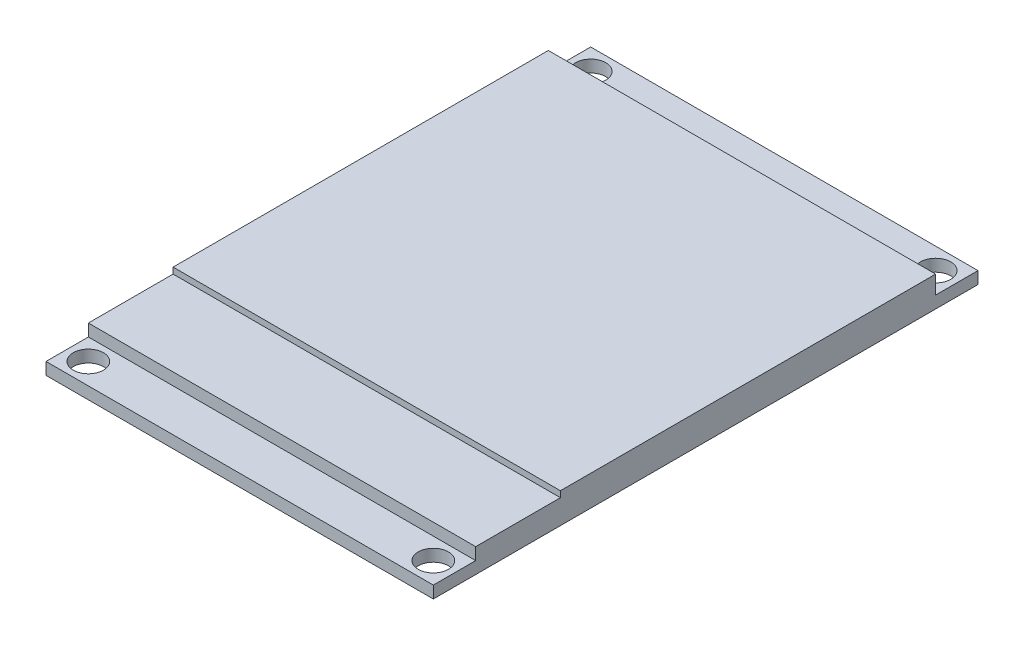
ISO-10303-21;
HEADER;
FILE_DESCRIPTION(('STEP AP214'),'2;1');
FILE_NAME('part.step','',(''),(''),'','','');
FILE_SCHEMA(('AUTOMOTIVE_DESIGN { 1 0 10303 214 1 1 1 1 }'));
ENDSEC;
DATA;
#1=APPLICATION_CONTEXT('core data for automotive mechanical design processes');
#2=APPLICATION_PROTOCOL_DEFINITION('international standard','automotive_design',2000,#1);
#3=PRODUCT_CONTEXT('',#1,'mechanical');
#4=PRODUCT('Part','Part','',(#3));
#5=PRODUCT_RELATED_PRODUCT_CATEGORY('part','',(#4));
#6=PRODUCT_DEFINITION_FORMATION('','',#4);
#7=PRODUCT_DEFINITION_CONTEXT('part definition',#1,'design');
#8=PRODUCT_DEFINITION('design','',#6,#7);
#9=PRODUCT_DEFINITION_SHAPE('','',#8);
#10=(LENGTH_UNIT() NAMED_UNIT(*) SI_UNIT(.MILLI.,.METRE.));
#11=(NAMED_UNIT(*) PLANE_ANGLE_UNIT() SI_UNIT($,.RADIAN.));
#12=(NAMED_UNIT(*) SI_UNIT($,.STERADIAN.) SOLID_ANGLE_UNIT());
#13=UNCERTAINTY_MEASURE_WITH_UNIT(LENGTH_MEASURE(1.E-05),#10,'distance_accuracy_value','');
#14=(GEOMETRIC_REPRESENTATION_CONTEXT(3) GLOBAL_UNCERTAINTY_ASSIGNED_CONTEXT((#13)) GLOBAL_UNIT_ASSIGNED_CONTEXT((#10,
#11,#12)) REPRESENTATION_CONTEXT('',''));
#15=CARTESIAN_POINT('',(0.,0.,0.));
#16=DIRECTION('',(0.,0.,1.));
#17=DIRECTION('',(1.,0.,0.));
#18=AXIS2_PLACEMENT_3D('',#15,#16,#17);
#19=CARTESIAN_POINT('',(0.,1.,0.));
#20=DIRECTION('',(0.,-1.,0.));
#21=DIRECTION('',(0.,0.,-1.));
#22=AXIS2_PLACEMENT_3D('',#19,#20,#21);
#23=PLANE('',#22);
#24=CARTESIAN_POINT('',(30.25,1.,-1.75));
#25=DIRECTION('',(0.,1.,0.));
#26=DIRECTION('',(0.,0.,-1.));
#27=AXIS2_PLACEMENT_3D('',#24,#25,#26);
#28=CIRCLE('',#27,1.25);
#29=CARTESIAN_POINT('',(30.25,1.,-3.));
#30=VERTEX_POINT('',#29);
#31=EDGE_CURVE('E170',#30,#30,#28,.T.);
#32=ORIENTED_EDGE('',*,*,#31,.F.);
#33=EDGE_LOOP('',(#32));
#34=FACE_BOUND('',#33,.T.);
#35=CARTESIAN_POINT('',(1.75,1.,-1.75));
#36=DIRECTION('',(0.,1.,0.));
#37=DIRECTION('',(0.,0.,1.));
#38=AXIS2_PLACEMENT_3D('',#35,#36,#37);
#39=CIRCLE('',#38,1.25);
#40=CARTESIAN_POINT('',(1.75,1.,-0.500000000000001));
#41=VERTEX_POINT('',#40);
#42=EDGE_CURVE('E164',#41,#41,#39,.T.);
#43=ORIENTED_EDGE('',*,*,#42,.F.);
#44=EDGE_LOOP('',(#43));
#45=FACE_BOUND('',#44,.T.);
#46=DIRECTION('',(1.,0.,0.));
#47=VECTOR('',#46,1.);
#48=CARTESIAN_POINT('',(0.,1.,-3.49999999999998));
#49=LINE('',#48,#47);
#50=CARTESIAN_POINT('',(0.,1.,-3.49999999999998));
#51=VERTEX_POINT('',#50);
#52=CARTESIAN_POINT('',(32.,1.,-3.49999999999998));
#53=VERTEX_POINT('',#52);
#54=EDGE_CURVE('E127',#51,#53,#49,.T.);
#55=ORIENTED_EDGE('',*,*,#54,.F.);
#56=DIRECTION('',(0.,0.,1.));
#57=VECTOR('',#56,1.);
#58=CARTESIAN_POINT('',(0.,1.,0.));
#59=LINE('',#58,#57);
#60=CARTESIAN_POINT('',(0.,1.,0.));
#61=VERTEX_POINT('',#60);
#62=EDGE_CURVE('E131',#51,#61,#59,.T.);
#63=ORIENTED_EDGE('',*,*,#62,.T.);
#64=DIRECTION('',(1.,0.,0.));
#65=VECTOR('',#64,1.);
#66=CARTESIAN_POINT('',(0.,1.,0.));
#67=LINE('',#66,#65);
#68=CARTESIAN_POINT('',(32.,1.,0.));
#69=VERTEX_POINT('',#68);
#70=EDGE_CURVE('E184',#61,#69,#67,.T.);
#71=ORIENTED_EDGE('',*,*,#70,.T.);
#72=DIRECTION('',(0.,0.,-1.));
#73=VECTOR('',#72,1.);
#74=CARTESIAN_POINT('',(32.,1.,0.));
#75=LINE('',#74,#73);
#76=EDGE_CURVE('E187',#69,#53,#75,.T.);
#77=ORIENTED_EDGE('',*,*,#76,.T.);
#78=EDGE_LOOP('',(#55,#63,#71,#77));
#79=FACE_BOUND('',#78,.T.);
#80=ADVANCED_FACE('F35',(#34,#45,#79),#23,.F.);
#81=CARTESIAN_POINT('',(1.75000000000001,1.,-43.25));
#82=DIRECTION('',(0.,1.,0.));
#83=DIRECTION('',(0.,0.,-1.));
#84=AXIS2_PLACEMENT_3D('',#81,#82,#83);
#85=CIRCLE('',#84,1.25);
#86=CARTESIAN_POINT('',(1.75000000000001,1.,-44.5));
#87=VERTEX_POINT('',#86);
#88=EDGE_CURVE('E158',#87,#87,#85,.T.);
#89=ORIENTED_EDGE('',*,*,#88,.F.);
#90=EDGE_LOOP('',(#89));
#91=FACE_BOUND('',#90,.T.);
#92=CARTESIAN_POINT('',(30.25,1.,-43.25));
#93=DIRECTION('',(0.,1.,0.));
#94=DIRECTION('',(0.,0.,1.));
#95=AXIS2_PLACEMENT_3D('',#92,#93,#94);
#96=CIRCLE('',#95,1.25);
#97=CARTESIAN_POINT('',(30.25,1.,-42.));
#98=VERTEX_POINT('',#97);
#99=EDGE_CURVE('E176',#98,#98,#96,.T.);
#100=ORIENTED_EDGE('',*,*,#99,.F.);
#101=EDGE_LOOP('',(#100));
#102=FACE_BOUND('',#101,.T.);
#103=DIRECTION('',(-1.,0.,0.));
#104=VECTOR('',#103,1.);
#105=CARTESIAN_POINT('',(0.,1.,-41.5));
#106=LINE('',#105,#104);
#107=CARTESIAN_POINT('',(32.,1.,-41.5));
#108=VERTEX_POINT('',#107);
#109=CARTESIAN_POINT('',(0.,1.,-41.5));
#110=VERTEX_POINT('',#109);
#111=EDGE_CURVE('E58',#108,#110,#106,.T.);
#112=ORIENTED_EDGE('',*,*,#111,.F.);
#113=CARTESIAN_POINT('',(32.,1.,-45.));
#114=VERTEX_POINT('',#113);
#115=EDGE_CURVE('E186',#108,#114,#75,.T.);
#116=ORIENTED_EDGE('',*,*,#115,.T.);
#117=DIRECTION('',(-1.,0.,0.));
#118=VECTOR('',#117,1.);
#119=CARTESIAN_POINT('',(0.,1.,-45.));
#120=LINE('',#119,#118);
#121=CARTESIAN_POINT('',(0.,1.,-45.));
#122=VERTEX_POINT('',#121);
#123=EDGE_CURVE('E190',#114,#122,#120,.T.);
#124=ORIENTED_EDGE('',*,*,#123,.T.);
#125=EDGE_CURVE('E182',#122,#110,#59,.T.);
#126=ORIENTED_EDGE('',*,*,#125,.T.);
#127=EDGE_LOOP('',(#112,#116,#124,#126));
#128=FACE_BOUND('',#127,.T.);
#129=ADVANCED_FACE('F226',(#91,#102,#128),#23,.F.);
#130=CARTESIAN_POINT('',(0.,0.,0.));
#131=DIRECTION('',(0.,-1.,0.));
#132=DIRECTION('',(0.,0.,-1.));
#133=AXIS2_PLACEMENT_3D('',#130,#131,#132);
#134=PLANE('',#133);
#135=CARTESIAN_POINT('',(1.75,0.,-1.75));
#136=DIRECTION('',(0.,1.,0.));
#137=DIRECTION('',(0.,0.,1.));
#138=AXIS2_PLACEMENT_3D('',#135,#136,#137);
#139=CIRCLE('',#138,1.25);
#140=CARTESIAN_POINT('',(1.75,0.,-0.500000000000001));
#141=VERTEX_POINT('',#140);
#142=EDGE_CURVE('E161',#141,#141,#139,.T.);
#143=ORIENTED_EDGE('',*,*,#142,.T.);
#144=EDGE_LOOP('',(#143));
#145=FACE_BOUND('',#144,.T.);
#146=CARTESIAN_POINT('',(30.25,0.,-43.25));
#147=DIRECTION('',(0.,1.,0.));
#148=DIRECTION('',(0.,0.,1.));
#149=AXIS2_PLACEMENT_3D('',#146,#147,#148);
#150=CIRCLE('',#149,1.25);
#151=CARTESIAN_POINT('',(30.25,0.,-42.));
#152=VERTEX_POINT('',#151);
#153=EDGE_CURVE('E173',#152,#152,#150,.T.);
#154=ORIENTED_EDGE('',*,*,#153,.T.);
#155=EDGE_LOOP('',(#154));
#156=FACE_BOUND('',#155,.T.);
#157=DIRECTION('',(0.,0.,1.));
#158=VECTOR('',#157,1.);
#159=CARTESIAN_POINT('',(0.,0.,0.));
#160=LINE('',#159,#158);
#161=CARTESIAN_POINT('',(0.,0.,-45.));
#162=VERTEX_POINT('',#161);
#163=CARTESIAN_POINT('',(0.,0.,0.));
#164=VERTEX_POINT('',#163);
#165=EDGE_CURVE('E179',#162,#164,#160,.T.);
#166=ORIENTED_EDGE('',*,*,#165,.F.);
#167=DIRECTION('',(-1.,0.,0.));
#168=VECTOR('',#167,1.);
#169=CARTESIAN_POINT('',(0.,0.,-45.));
#170=LINE('',#169,#168);
#171=CARTESIAN_POINT('',(32.,0.,-45.));
#172=VERTEX_POINT('',#171);
#173=EDGE_CURVE('E199',#172,#162,#170,.T.);
#174=ORIENTED_EDGE('',*,*,#173,.F.);
#175=DIRECTION('',(0.,0.,-1.));
#176=VECTOR('',#175,1.);
#177=CARTESIAN_POINT('',(32.,0.,0.));
#178=LINE('',#177,#176);
#179=CARTESIAN_POINT('',(32.,0.,0.));
#180=VERTEX_POINT('',#179);
#181=EDGE_CURVE('E197',#180,#172,#178,.T.);
#182=ORIENTED_EDGE('',*,*,#181,.F.);
#183=DIRECTION('',(1.,0.,0.));
#184=VECTOR('',#183,1.);
#185=CARTESIAN_POINT('',(0.,0.,0.));
#186=LINE('',#185,#184);
#187=EDGE_CURVE('E195',#164,#180,#186,.T.);
#188=ORIENTED_EDGE('',*,*,#187,.F.);
#189=EDGE_LOOP('',(#166,#174,#182,#188));
#190=FACE_BOUND('',#189,.T.);
#191=CARTESIAN_POINT('',(30.25,0.,-1.75));
#192=DIRECTION('',(0.,1.,0.));
#193=DIRECTION('',(0.,0.,-1.));
#194=AXIS2_PLACEMENT_3D('',#191,#192,#193);
#195=CIRCLE('',#194,1.25);
#196=CARTESIAN_POINT('',(30.25,0.,-3.));
#197=VERTEX_POINT('',#196);
#198=EDGE_CURVE('E167',#197,#197,#195,.T.);
#199=ORIENTED_EDGE('',*,*,#198,.T.);
#200=EDGE_LOOP('',(#199));
#201=FACE_BOUND('',#200,.T.);
#202=CARTESIAN_POINT('',(1.75000000000001,0.,-43.25));
#203=DIRECTION('',(0.,1.,0.));
#204=DIRECTION('',(0.,0.,-1.));
#205=AXIS2_PLACEMENT_3D('',#202,#203,#204);
#206=CIRCLE('',#205,1.25);
#207=CARTESIAN_POINT('',(1.75000000000001,0.,-44.5));
#208=VERTEX_POINT('',#207);
#209=EDGE_CURVE('E157',#208,#208,#206,.T.);
#210=ORIENTED_EDGE('',*,*,#209,.T.);
#211=EDGE_LOOP('',(#210));
#212=FACE_BOUND('',#211,.T.);
#213=ADVANCED_FACE('F217',(#145,#156,#190,#201,#212),#134,.T.);
#214=CARTESIAN_POINT('',(0.,1.,0.));
#215=DIRECTION('',(1.,0.,0.));
#216=DIRECTION('',(0.,0.,-1.));
#217=AXIS2_PLACEMENT_3D('',#214,#215,#216);
#218=PLANE('',#217);
#219=ORIENTED_EDGE('',*,*,#62,.F.);
#220=DIRECTION('',(0.,-1.,0.));
#221=VECTOR('',#220,1.);
#222=CARTESIAN_POINT('',(0.,2.,-3.49999999999998));
#223=LINE('',#222,#221);
#224=CARTESIAN_POINT('',(0.,2.,-3.49999999999998));
#225=VERTEX_POINT('',#224);
#226=EDGE_CURVE('E115',#225,#51,#223,.T.);
#227=ORIENTED_EDGE('',*,*,#226,.F.);
#228=DIRECTION('',(0.,0.,1.));
#229=VECTOR('',#228,1.);
#230=CARTESIAN_POINT('',(0.,2.,-10.5));
#231=LINE('',#230,#229);
#232=CARTESIAN_POINT('',(0.,2.,-10.5));
#233=VERTEX_POINT('',#232);
#234=EDGE_CURVE('E119',#233,#225,#231,.T.);
#235=ORIENTED_EDGE('',*,*,#234,.F.);
#236=DIRECTION('',(0.,-1.,0.));
#237=VECTOR('',#236,1.);
#238=CARTESIAN_POINT('',(0.,2.5,-10.5));
#239=LINE('',#238,#237);
#240=CARTESIAN_POINT('',(0.,2.5,-10.5));
#241=VERTEX_POINT('',#240);
#242=EDGE_CURVE('E155',#241,#233,#239,.T.);
#243=ORIENTED_EDGE('',*,*,#242,.F.);
#244=DIRECTION('',(0.,0.,1.));
#245=VECTOR('',#244,1.);
#246=CARTESIAN_POINT('',(0.,2.5,-41.5));
#247=LINE('',#246,#245);
#248=CARTESIAN_POINT('',(0.,2.5,-41.5));
#249=VERTEX_POINT('',#248);
#250=EDGE_CURVE('E133',#249,#241,#247,.T.);
#251=ORIENTED_EDGE('',*,*,#250,.F.);
#252=DIRECTION('',(0.,-1.,0.));
#253=VECTOR('',#252,1.);
#254=CARTESIAN_POINT('',(0.,2.5,-41.5));
#255=LINE('',#254,#253);
#256=EDGE_CURVE('E145',#249,#110,#255,.T.);
#257=ORIENTED_EDGE('',*,*,#256,.T.);
#258=ORIENTED_EDGE('',*,*,#125,.F.);
#259=DIRECTION('',(0.,-1.,0.));
#260=VECTOR('',#259,1.);
#261=CARTESIAN_POINT('',(0.,1.,-45.));
#262=LINE('',#261,#260);
#263=EDGE_CURVE('E192',#122,#162,#262,.T.);
#264=ORIENTED_EDGE('',*,*,#263,.T.);
#265=ORIENTED_EDGE('',*,*,#165,.T.);
#266=DIRECTION('',(0.,-1.,0.));
#267=VECTOR('',#266,1.);
#268=CARTESIAN_POINT('',(0.,1.,0.));
#269=LINE('',#268,#267);
#270=EDGE_CURVE('E11',#61,#164,#269,.T.);
#271=ORIENTED_EDGE('',*,*,#270,.F.);
#272=EDGE_LOOP('',(#219,#227,#235,#243,#251,#257,#258,#264,#265,#271));
#273=FACE_BOUND('',#272,.T.);
#274=ADVANCED_FACE('F37',(#273),#218,.F.);
#275=CARTESIAN_POINT('',(0.,1.,0.));
#276=DIRECTION('',(0.,0.,-1.));
#277=DIRECTION('',(-1.,0.,0.));
#278=AXIS2_PLACEMENT_3D('',#275,#276,#277);
#279=PLANE('',#278);
#280=ORIENTED_EDGE('',*,*,#187,.T.);
#281=DIRECTION('',(0.,-1.,0.));
#282=VECTOR('',#281,1.);
#283=CARTESIAN_POINT('',(32.,1.,0.));
#284=LINE('',#283,#282);
#285=EDGE_CURVE('E43',#69,#180,#284,.T.);
#286=ORIENTED_EDGE('',*,*,#285,.F.);
#287=ORIENTED_EDGE('',*,*,#70,.F.);
#288=ORIENTED_EDGE('',*,*,#270,.T.);
#289=EDGE_LOOP('',(#280,#286,#287,#288));
#290=FACE_BOUND('',#289,.T.);
#291=ADVANCED_FACE('F240',(#290),#279,.F.);
#292=CARTESIAN_POINT('',(32.,1.,0.));
#293=DIRECTION('',(-1.,0.,0.));
#294=DIRECTION('',(0.,0.,1.));
#295=AXIS2_PLACEMENT_3D('',#292,#293,#294);
#296=PLANE('',#295);
#297=ORIENTED_EDGE('',*,*,#181,.T.);
#298=DIRECTION('',(0.,-1.,0.));
#299=VECTOR('',#298,1.);
#300=CARTESIAN_POINT('',(32.,1.,-45.));
#301=LINE('',#300,#299);
#302=EDGE_CURVE('E203',#114,#172,#301,.T.);
#303=ORIENTED_EDGE('',*,*,#302,.F.);
#304=ORIENTED_EDGE('',*,*,#115,.F.);
#305=DIRECTION('',(0.,-1.,0.));
#306=VECTOR('',#305,1.);
#307=CARTESIAN_POINT('',(32.,2.5,-41.5));
#308=LINE('',#307,#306);
#309=CARTESIAN_POINT('',(32.,2.5,-41.5));
#310=VERTEX_POINT('',#309);
#311=EDGE_CURVE('E149',#310,#108,#308,.T.);
#312=ORIENTED_EDGE('',*,*,#311,.F.);
#313=DIRECTION('',(0.,0.,-1.));
#314=VECTOR('',#313,1.);
#315=CARTESIAN_POINT('',(32.,2.5,-41.5));
#316=LINE('',#315,#314);
#317=CARTESIAN_POINT('',(32.,2.5,-10.5));
#318=VERTEX_POINT('',#317);
#319=EDGE_CURVE('E142',#318,#310,#316,.T.);
#320=ORIENTED_EDGE('',*,*,#319,.F.);
#321=DIRECTION('',(0.,-1.,0.));
#322=VECTOR('',#321,1.);
#323=CARTESIAN_POINT('',(32.,2.5,-10.5));
#324=LINE('',#323,#322);
#325=CARTESIAN_POINT('',(32.,2.,-10.5));
#326=VERTEX_POINT('',#325);
#327=EDGE_CURVE('E152',#318,#326,#324,.T.);
#328=ORIENTED_EDGE('',*,*,#327,.T.);
#329=DIRECTION('',(0.,0.,-1.));
#330=VECTOR('',#329,1.);
#331=CARTESIAN_POINT('',(32.,2.,-10.5));
#332=LINE('',#331,#330);
#333=CARTESIAN_POINT('',(32.,2.,-3.49999999999998));
#334=VERTEX_POINT('',#333);
#335=EDGE_CURVE('E50',#334,#326,#332,.T.);
#336=ORIENTED_EDGE('',*,*,#335,.F.);
#337=DIRECTION('',(0.,-1.,0.));
#338=VECTOR('',#337,1.);
#339=CARTESIAN_POINT('',(32.,2.,-3.49999999999998));
#340=LINE('',#339,#338);
#341=EDGE_CURVE('E118',#334,#53,#340,.T.);
#342=ORIENTED_EDGE('',*,*,#341,.T.);
#343=ORIENTED_EDGE('',*,*,#76,.F.);
#344=ORIENTED_EDGE('',*,*,#285,.T.);
#345=EDGE_LOOP('',(#297,#303,#304,#312,#320,#328,#336,#342,#343,#344));
#346=FACE_BOUND('',#345,.T.);
#347=ADVANCED_FACE('F210',(#346),#296,.F.);
#348=CARTESIAN_POINT('',(0.,1.,-45.));
#349=DIRECTION('',(0.,0.,1.));
#350=DIRECTION('',(1.,0.,0.));
#351=AXIS2_PLACEMENT_3D('',#348,#349,#350);
#352=PLANE('',#351);
#353=ORIENTED_EDGE('',*,*,#173,.T.);
#354=ORIENTED_EDGE('',*,*,#263,.F.);
#355=ORIENTED_EDGE('',*,*,#123,.F.);
#356=ORIENTED_EDGE('',*,*,#302,.T.);
#357=EDGE_LOOP('',(#353,#354,#355,#356));
#358=FACE_BOUND('',#357,.T.);
#359=ADVANCED_FACE('F221',(#358),#352,.F.);
#360=CARTESIAN_POINT('',(30.25,1.,-43.25));
#361=DIRECTION('',(0.,-1.,0.));
#362=DIRECTION('',(0.,0.,-1.));
#363=AXIS2_PLACEMENT_3D('',#360,#361,#362);
#364=CYLINDRICAL_SURFACE('',#363,1.25);
#365=ORIENTED_EDGE('',*,*,#99,.T.);
#366=EDGE_LOOP('',(#365));
#367=FACE_BOUND('',#366,.T.);
#368=ORIENTED_EDGE('',*,*,#153,.F.);
#369=EDGE_LOOP('',(#368));
#370=FACE_BOUND('',#369,.T.);
#371=ADVANCED_FACE('F258',(#367,#370),#364,.F.);
#372=CARTESIAN_POINT('',(30.25,1.,-1.75));
#373=DIRECTION('',(0.,-1.,0.));
#374=DIRECTION('',(0.,0.,-1.));
#375=AXIS2_PLACEMENT_3D('',#372,#373,#374);
#376=CYLINDRICAL_SURFACE('',#375,1.25);
#377=ORIENTED_EDGE('',*,*,#31,.T.);
#378=EDGE_LOOP('',(#377));
#379=FACE_BOUND('',#378,.T.);
#380=ORIENTED_EDGE('',*,*,#198,.F.);
#381=EDGE_LOOP('',(#380));
#382=FACE_BOUND('',#381,.T.);
#383=ADVANCED_FACE('F267',(#379,#382),#376,.F.);
#384=CARTESIAN_POINT('',(1.75,1.,-1.75));
#385=DIRECTION('',(0.,-1.,0.));
#386=DIRECTION('',(0.,0.,-1.));
#387=AXIS2_PLACEMENT_3D('',#384,#385,#386);
#388=CYLINDRICAL_SURFACE('',#387,1.25);
#389=ORIENTED_EDGE('',*,*,#42,.T.);
#390=EDGE_LOOP('',(#389));
#391=FACE_BOUND('',#390,.T.);
#392=ORIENTED_EDGE('',*,*,#142,.F.);
#393=EDGE_LOOP('',(#392));
#394=FACE_BOUND('',#393,.T.);
#395=ADVANCED_FACE('F272',(#391,#394),#388,.F.);
#396=CARTESIAN_POINT('',(1.75000000000001,1.,-43.25));
#397=DIRECTION('',(0.,-1.,0.));
#398=DIRECTION('',(0.,0.,-1.));
#399=AXIS2_PLACEMENT_3D('',#396,#397,#398);
#400=CYLINDRICAL_SURFACE('',#399,1.25);
#401=ORIENTED_EDGE('',*,*,#88,.T.);
#402=EDGE_LOOP('',(#401));
#403=FACE_BOUND('',#402,.T.);
#404=ORIENTED_EDGE('',*,*,#209,.F.);
#405=EDGE_LOOP('',(#404));
#406=FACE_BOUND('',#405,.T.);
#407=ADVANCED_FACE('F282',(#403,#406),#400,.F.);
#408=CARTESIAN_POINT('',(0.,2.5,-10.5));
#409=DIRECTION('',(0.,0.,-1.));
#410=DIRECTION('',(-1.,0.,0.));
#411=AXIS2_PLACEMENT_3D('',#408,#409,#410);
#412=PLANE('',#411);
#413=ORIENTED_EDGE('',*,*,#242,.T.);
#414=DIRECTION('',(-1.,0.,0.));
#415=VECTOR('',#414,1.);
#416=CARTESIAN_POINT('',(0.,2.,-10.5));
#417=LINE('',#416,#415);
#418=EDGE_CURVE('E123',#326,#233,#417,.T.);
#419=ORIENTED_EDGE('',*,*,#418,.F.);
#420=ORIENTED_EDGE('',*,*,#327,.F.);
#421=DIRECTION('',(1.,0.,0.));
#422=VECTOR('',#421,1.);
#423=CARTESIAN_POINT('',(0.,2.5,-10.5));
#424=LINE('',#423,#422);
#425=EDGE_CURVE('E140',#241,#318,#424,.T.);
#426=ORIENTED_EDGE('',*,*,#425,.F.);
#427=EDGE_LOOP('',(#413,#419,#420,#426));
#428=FACE_BOUND('',#427,.T.);
#429=ADVANCED_FACE('F236',(#428),#412,.F.);
#430=CARTESIAN_POINT('',(0.,2.5,-41.5));
#431=DIRECTION('',(0.,0.,1.));
#432=DIRECTION('',(1.,0.,0.));
#433=AXIS2_PLACEMENT_3D('',#430,#431,#432);
#434=PLANE('',#433);
#435=ORIENTED_EDGE('',*,*,#111,.T.);
#436=ORIENTED_EDGE('',*,*,#256,.F.);
#437=DIRECTION('',(-1.,0.,0.));
#438=VECTOR('',#437,1.);
#439=CARTESIAN_POINT('',(0.,2.5,-41.5));
#440=LINE('',#439,#438);
#441=EDGE_CURVE('E144',#310,#249,#440,.T.);
#442=ORIENTED_EDGE('',*,*,#441,.F.);
#443=ORIENTED_EDGE('',*,*,#311,.T.);
#444=EDGE_LOOP('',(#435,#436,#442,#443));
#445=FACE_BOUND('',#444,.T.);
#446=ADVANCED_FACE('F228',(#445),#434,.F.);
#447=CARTESIAN_POINT('',(0.,2.5,0.));
#448=DIRECTION('',(0.,1.,0.));
#449=DIRECTION('',(0.,0.,1.));
#450=AXIS2_PLACEMENT_3D('',#447,#448,#449);
#451=PLANE('',#450);
#452=ORIENTED_EDGE('',*,*,#250,.T.);
#453=ORIENTED_EDGE('',*,*,#425,.T.);
#454=ORIENTED_EDGE('',*,*,#319,.T.);
#455=ORIENTED_EDGE('',*,*,#441,.T.);
#456=EDGE_LOOP('',(#452,#453,#454,#455));
#457=FACE_BOUND('',#456,.T.);
#458=ADVANCED_FACE('F234',(#457),#451,.T.);
#459=CARTESIAN_POINT('',(0.,2.,-3.49999999999998));
#460=DIRECTION('',(0.,0.,-1.));
#461=DIRECTION('',(-1.,0.,0.));
#462=AXIS2_PLACEMENT_3D('',#459,#460,#461);
#463=PLANE('',#462);
#464=ORIENTED_EDGE('',*,*,#54,.T.);
#465=ORIENTED_EDGE('',*,*,#341,.F.);
#466=DIRECTION('',(1.,0.,0.));
#467=VECTOR('',#466,1.);
#468=CARTESIAN_POINT('',(0.,2.,-3.49999999999998));
#469=LINE('',#468,#467);
#470=EDGE_CURVE('E111',#225,#334,#469,.T.);
#471=ORIENTED_EDGE('',*,*,#470,.F.);
#472=ORIENTED_EDGE('',*,*,#226,.T.);
#473=EDGE_LOOP('',(#464,#465,#471,#472));
#474=FACE_BOUND('',#473,.T.);
#475=ADVANCED_FACE('F113',(#474),#463,.F.);
#476=CARTESIAN_POINT('',(0.,2.,0.));
#477=DIRECTION('',(0.,1.,0.));
#478=DIRECTION('',(0.,0.,1.));
#479=AXIS2_PLACEMENT_3D('',#476,#477,#478);
#480=PLANE('',#479);
#481=ORIENTED_EDGE('',*,*,#234,.T.);
#482=ORIENTED_EDGE('',*,*,#470,.T.);
#483=ORIENTED_EDGE('',*,*,#335,.T.);
#484=ORIENTED_EDGE('',*,*,#418,.T.);
#485=EDGE_LOOP('',(#481,#482,#483,#484));
#486=FACE_BOUND('',#485,.T.);
#487=ADVANCED_FACE('F122',(#486),#480,.T.);
#488=CLOSED_SHELL('',(#80,#129,#213,#274,#291,#347,#359,#371,#383,#395,#407,#429,#446,#458,#475,#487));
#489=MANIFOLD_SOLID_BREP('B2',#488);
#490=ADVANCED_BREP_SHAPE_REPRESENTATION('',(#18,#489),#14);
#491=SHAPE_DEFINITION_REPRESENTATION(#9,#490);
ENDSEC;
END-ISO-10303-21;
